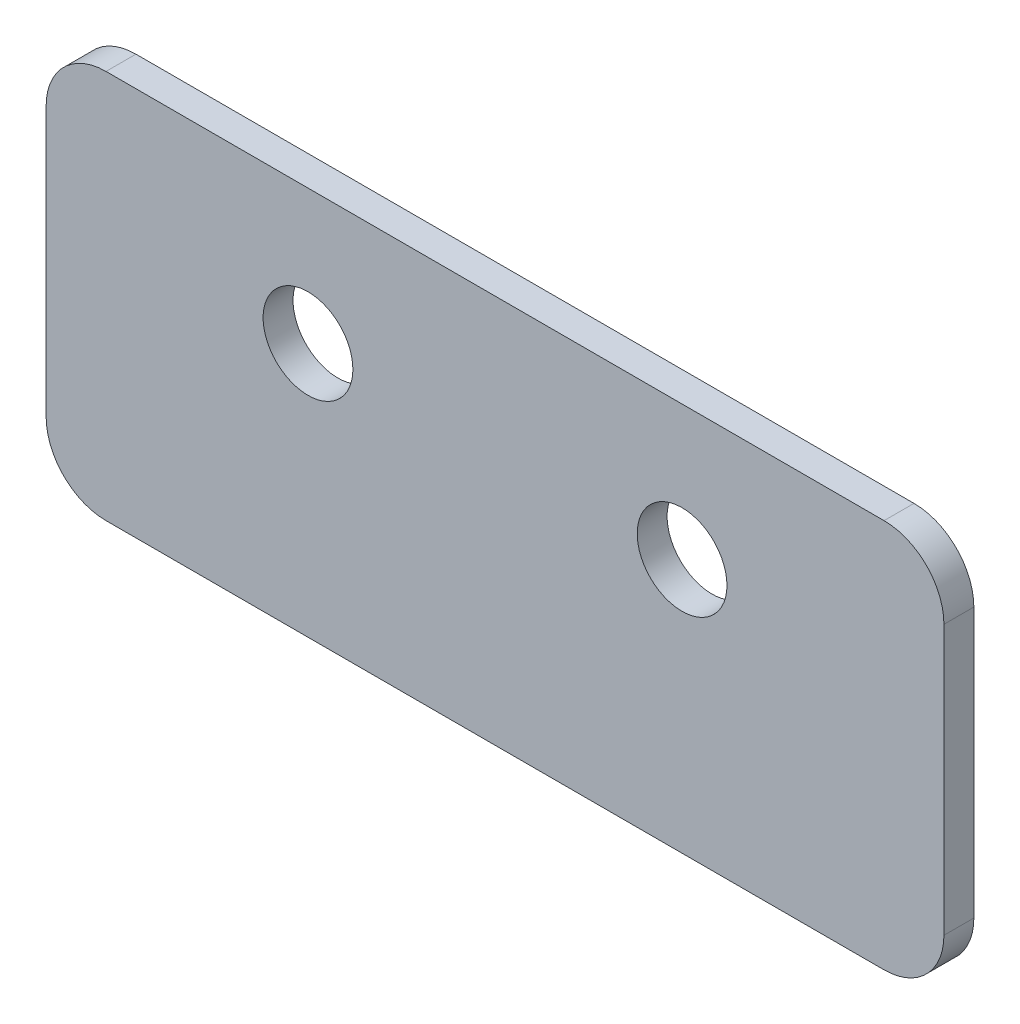
ISO-10303-21;
HEADER;
FILE_DESCRIPTION(('STEP AP214'),'2;1');
FILE_NAME('part.step','',(''),(''),'','','');
FILE_SCHEMA(('AUTOMOTIVE_DESIGN { 1 0 10303 214 1 1 1 1 }'));
ENDSEC;
DATA;
#1=APPLICATION_CONTEXT('core data for automotive mechanical design processes');
#2=APPLICATION_PROTOCOL_DEFINITION('international standard','automotive_design',2000,#1);
#3=PRODUCT_CONTEXT('',#1,'mechanical');
#4=PRODUCT('Part','Part','',(#3));
#5=PRODUCT_RELATED_PRODUCT_CATEGORY('part','',(#4));
#6=PRODUCT_DEFINITION_FORMATION('','',#4);
#7=PRODUCT_DEFINITION_CONTEXT('part definition',#1,'design');
#8=PRODUCT_DEFINITION('design','',#6,#7);
#9=PRODUCT_DEFINITION_SHAPE('','',#8);
#10=(LENGTH_UNIT() NAMED_UNIT(*) SI_UNIT(.MILLI.,.METRE.));
#11=(NAMED_UNIT(*) PLANE_ANGLE_UNIT() SI_UNIT($,.RADIAN.));
#12=(NAMED_UNIT(*) SI_UNIT($,.STERADIAN.) SOLID_ANGLE_UNIT());
#13=UNCERTAINTY_MEASURE_WITH_UNIT(LENGTH_MEASURE(1.E-05),#10,'distance_accuracy_value','');
#14=(GEOMETRIC_REPRESENTATION_CONTEXT(3) GLOBAL_UNCERTAINTY_ASSIGNED_CONTEXT((#13)) GLOBAL_UNIT_ASSIGNED_CONTEXT((#10,
#11,#12)) REPRESENTATION_CONTEXT('',''));
#15=CARTESIAN_POINT('',(0.,0.,0.));
#16=DIRECTION('',(0.,0.,1.));
#17=DIRECTION('',(1.,0.,0.));
#18=AXIS2_PLACEMENT_3D('',#15,#16,#17);
#19=CARTESIAN_POINT('',(13.,-6.5,1.));
#20=DIRECTION('',(0.,0.,1.));
#21=DIRECTION('',(1.,0.,0.));
#22=AXIS2_PLACEMENT_3D('',#19,#20,#21);
#23=PLANE('',#22);
#24=CARTESIAN_POINT('',(-6.25,0.,1.));
#25=DIRECTION('',(0.,0.,1.));
#26=DIRECTION('',(1.,0.,0.));
#27=AXIS2_PLACEMENT_3D('',#24,#25,#26);
#28=CIRCLE('',#27,1.5);
#29=CARTESIAN_POINT('',(-4.75,0.,1.));
#30=VERTEX_POINT('',#29);
#31=EDGE_CURVE('E134',#30,#30,#28,.T.);
#32=ORIENTED_EDGE('',*,*,#31,.F.);
#33=EDGE_LOOP('',(#32));
#34=FACE_BOUND('',#33,.T.);
#35=CARTESIAN_POINT('',(13.,-6.5,1.));
#36=DIRECTION('',(0.,0.,1.));
#37=DIRECTION('',(1.,0.,0.));
#38=AXIS2_PLACEMENT_3D('',#35,#36,#37);
#39=CIRCLE('',#38,2.);
#40=CARTESIAN_POINT('',(13.,-8.5,1.));
#41=VERTEX_POINT('',#40);
#42=CARTESIAN_POINT('',(15.,-6.5,1.));
#43=VERTEX_POINT('',#42);
#44=EDGE_CURVE('E145',#41,#43,#39,.T.);
#45=ORIENTED_EDGE('',*,*,#44,.T.);
#46=DIRECTION('',(0.,1.,0.));
#47=VECTOR('',#46,1.);
#48=CARTESIAN_POINT('',(15.,2.5,1.));
#49=LINE('',#48,#47);
#50=CARTESIAN_POINT('',(15.,2.5,1.));
#51=VERTEX_POINT('',#50);
#52=EDGE_CURVE('E93',#43,#51,#49,.T.);
#53=ORIENTED_EDGE('',*,*,#52,.T.);
#54=CARTESIAN_POINT('',(13.,2.5,1.));
#55=DIRECTION('',(0.,0.,1.));
#56=DIRECTION('',(-1.,0.,0.));
#57=AXIS2_PLACEMENT_3D('',#54,#55,#56);
#58=CIRCLE('',#57,2.);
#59=CARTESIAN_POINT('',(13.,4.50000000000001,1.));
#60=VERTEX_POINT('',#59);
#61=EDGE_CURVE('E160',#51,#60,#58,.T.);
#62=ORIENTED_EDGE('',*,*,#61,.T.);
#63=DIRECTION('',(-1.,0.,0.));
#64=VECTOR('',#63,1.);
#65=CARTESIAN_POINT('',(-13.,4.5,1.));
#66=LINE('',#65,#64);
#67=CARTESIAN_POINT('',(-13.,4.5,1.));
#68=VERTEX_POINT('',#67);
#69=EDGE_CURVE('E173',#60,#68,#66,.T.);
#70=ORIENTED_EDGE('',*,*,#69,.T.);
#71=CARTESIAN_POINT('',(-13.,2.5,1.));
#72=DIRECTION('',(0.,0.,1.));
#73=DIRECTION('',(1.,0.,0.));
#74=AXIS2_PLACEMENT_3D('',#71,#72,#73);
#75=CIRCLE('',#74,2.);
#76=CARTESIAN_POINT('',(-15.,2.5,1.));
#77=VERTEX_POINT('',#76);
#78=EDGE_CURVE('E112',#68,#77,#75,.T.);
#79=ORIENTED_EDGE('',*,*,#78,.T.);
#80=DIRECTION('',(0.,-1.,0.));
#81=VECTOR('',#80,1.);
#82=CARTESIAN_POINT('',(-15.,2.5,1.));
#83=LINE('',#82,#81);
#84=CARTESIAN_POINT('',(-15.,-6.5,1.));
#85=VERTEX_POINT('',#84);
#86=EDGE_CURVE('E106',#77,#85,#83,.T.);
#87=ORIENTED_EDGE('',*,*,#86,.T.);
#88=CARTESIAN_POINT('',(-13.,-6.5,1.));
#89=DIRECTION('',(0.,0.,1.));
#90=DIRECTION('',(1.,0.,0.));
#91=AXIS2_PLACEMENT_3D('',#88,#89,#90);
#92=CIRCLE('',#91,2.);
#93=CARTESIAN_POINT('',(-13.,-8.5,1.));
#94=VERTEX_POINT('',#93);
#95=EDGE_CURVE('E110',#85,#94,#92,.T.);
#96=ORIENTED_EDGE('',*,*,#95,.T.);
#97=DIRECTION('',(1.,0.,0.));
#98=VECTOR('',#97,1.);
#99=CARTESIAN_POINT('',(-13.,-8.5,1.));
#100=LINE('',#99,#98);
#101=EDGE_CURVE('E50',#94,#41,#100,.T.);
#102=ORIENTED_EDGE('',*,*,#101,.T.);
#103=EDGE_LOOP('',(#45,#53,#62,#70,#79,#87,#96,#102));
#104=FACE_BOUND('',#103,.T.);
#105=CARTESIAN_POINT('',(6.25,0.,1.));
#106=DIRECTION('',(0.,0.,1.));
#107=DIRECTION('',(1.,0.,0.));
#108=AXIS2_PLACEMENT_3D('',#105,#106,#107);
#109=CIRCLE('',#108,1.5);
#110=CARTESIAN_POINT('',(7.75,0.,1.));
#111=VERTEX_POINT('',#110);
#112=EDGE_CURVE('E182',#111,#111,#109,.T.);
#113=ORIENTED_EDGE('',*,*,#112,.F.);
#114=EDGE_LOOP('',(#113));
#115=FACE_BOUND('',#114,.T.);
#116=ADVANCED_FACE('F33',(#34,#104,#115),#23,.T.);
#117=CARTESIAN_POINT('',(13.,-6.5,0.));
#118=DIRECTION('',(0.,0.,1.));
#119=DIRECTION('',(1.,0.,0.));
#120=AXIS2_PLACEMENT_3D('',#117,#118,#119);
#121=PLANE('',#120);
#122=CARTESIAN_POINT('',(13.,-6.5,0.));
#123=DIRECTION('',(0.,0.,1.));
#124=DIRECTION('',(1.,0.,0.));
#125=AXIS2_PLACEMENT_3D('',#122,#123,#124);
#126=CIRCLE('',#125,2.);
#127=CARTESIAN_POINT('',(13.,-8.5,0.));
#128=VERTEX_POINT('',#127);
#129=CARTESIAN_POINT('',(15.,-6.5,0.));
#130=VERTEX_POINT('',#129);
#131=EDGE_CURVE('E130',#128,#130,#126,.T.);
#132=ORIENTED_EDGE('',*,*,#131,.F.);
#133=DIRECTION('',(1.,0.,0.));
#134=VECTOR('',#133,1.);
#135=CARTESIAN_POINT('',(-13.,-8.5,0.));
#136=LINE('',#135,#134);
#137=CARTESIAN_POINT('',(-13.,-8.5,0.));
#138=VERTEX_POINT('',#137);
#139=EDGE_CURVE('E85',#138,#128,#136,.T.);
#140=ORIENTED_EDGE('',*,*,#139,.F.);
#141=CARTESIAN_POINT('',(-13.,-6.5,0.));
#142=DIRECTION('',(0.,0.,1.));
#143=DIRECTION('',(1.,0.,0.));
#144=AXIS2_PLACEMENT_3D('',#141,#142,#143);
#145=CIRCLE('',#144,2.);
#146=CARTESIAN_POINT('',(-15.,-6.5,0.));
#147=VERTEX_POINT('',#146);
#148=EDGE_CURVE('E79',#147,#138,#145,.T.);
#149=ORIENTED_EDGE('',*,*,#148,.F.);
#150=DIRECTION('',(0.,-1.,0.));
#151=VECTOR('',#150,1.);
#152=CARTESIAN_POINT('',(-15.,2.5,0.));
#153=LINE('',#152,#151);
#154=CARTESIAN_POINT('',(-15.,2.5,0.));
#155=VERTEX_POINT('',#154);
#156=EDGE_CURVE('E120',#155,#147,#153,.T.);
#157=ORIENTED_EDGE('',*,*,#156,.F.);
#158=CARTESIAN_POINT('',(-13.,2.5,0.));
#159=DIRECTION('',(0.,0.,1.));
#160=DIRECTION('',(1.,0.,0.));
#161=AXIS2_PLACEMENT_3D('',#158,#159,#160);
#162=CIRCLE('',#161,2.);
#163=CARTESIAN_POINT('',(-13.,4.5,0.));
#164=VERTEX_POINT('',#163);
#165=EDGE_CURVE('E140',#164,#155,#162,.T.);
#166=ORIENTED_EDGE('',*,*,#165,.F.);
#167=DIRECTION('',(-1.,0.,0.));
#168=VECTOR('',#167,1.);
#169=CARTESIAN_POINT('',(-13.,4.5,0.));
#170=LINE('',#169,#168);
#171=CARTESIAN_POINT('',(13.,4.50000000000001,0.));
#172=VERTEX_POINT('',#171);
#173=EDGE_CURVE('E138',#172,#164,#170,.T.);
#174=ORIENTED_EDGE('',*,*,#173,.F.);
#175=CARTESIAN_POINT('',(13.,2.5,0.));
#176=DIRECTION('',(0.,0.,1.));
#177=DIRECTION('',(-1.,0.,0.));
#178=AXIS2_PLACEMENT_3D('',#175,#176,#177);
#179=CIRCLE('',#178,2.);
#180=CARTESIAN_POINT('',(15.,2.5,0.));
#181=VERTEX_POINT('',#180);
#182=EDGE_CURVE('E136',#181,#172,#179,.T.);
#183=ORIENTED_EDGE('',*,*,#182,.F.);
#184=DIRECTION('',(0.,1.,0.));
#185=VECTOR('',#184,1.);
#186=CARTESIAN_POINT('',(15.,2.5,0.));
#187=LINE('',#186,#185);
#188=EDGE_CURVE('E133',#130,#181,#187,.T.);
#189=ORIENTED_EDGE('',*,*,#188,.F.);
#190=EDGE_LOOP('',(#132,#140,#149,#157,#166,#174,#183,#189));
#191=FACE_BOUND('',#190,.T.);
#192=CARTESIAN_POINT('',(-6.25,0.,0.));
#193=DIRECTION('',(0.,0.,1.));
#194=DIRECTION('',(1.,0.,0.));
#195=AXIS2_PLACEMENT_3D('',#192,#193,#194);
#196=CIRCLE('',#195,1.5);
#197=CARTESIAN_POINT('',(-4.75,0.,0.));
#198=VERTEX_POINT('',#197);
#199=EDGE_CURVE('E179',#198,#198,#196,.T.);
#200=ORIENTED_EDGE('',*,*,#199,.T.);
#201=EDGE_LOOP('',(#200));
#202=FACE_BOUND('',#201,.T.);
#203=CARTESIAN_POINT('',(6.25,0.,0.));
#204=DIRECTION('',(0.,0.,1.));
#205=DIRECTION('',(1.,0.,0.));
#206=AXIS2_PLACEMENT_3D('',#203,#204,#205);
#207=CIRCLE('',#206,1.5);
#208=CARTESIAN_POINT('',(7.75,0.,0.));
#209=VERTEX_POINT('',#208);
#210=EDGE_CURVE('E185',#209,#209,#207,.T.);
#211=ORIENTED_EDGE('',*,*,#210,.T.);
#212=EDGE_LOOP('',(#211));
#213=FACE_BOUND('',#212,.T.);
#214=ADVANCED_FACE('F164',(#191,#202,#213),#121,.F.);
#215=CARTESIAN_POINT('',(13.,-6.5,1.));
#216=DIRECTION('',(0.,0.,-1.));
#217=DIRECTION('',(-1.,0.,0.));
#218=AXIS2_PLACEMENT_3D('',#215,#216,#217);
#219=CYLINDRICAL_SURFACE('',#218,2.);
#220=ORIENTED_EDGE('',*,*,#131,.T.);
#221=DIRECTION('',(0.,0.,-1.));
#222=VECTOR('',#221,1.);
#223=CARTESIAN_POINT('',(15.,-6.5,1.));
#224=LINE('',#223,#222);
#225=EDGE_CURVE('E11',#43,#130,#224,.T.);
#226=ORIENTED_EDGE('',*,*,#225,.F.);
#227=ORIENTED_EDGE('',*,*,#44,.F.);
#228=DIRECTION('',(0.,0.,-1.));
#229=VECTOR('',#228,1.);
#230=CARTESIAN_POINT('',(13.,-8.5,1.));
#231=LINE('',#230,#229);
#232=EDGE_CURVE('E126',#41,#128,#231,.T.);
#233=ORIENTED_EDGE('',*,*,#232,.T.);
#234=EDGE_LOOP('',(#220,#226,#227,#233));
#235=FACE_BOUND('',#234,.T.);
#236=ADVANCED_FACE('F35',(#235),#219,.T.);
#237=CARTESIAN_POINT('',(15.,2.5,1.));
#238=DIRECTION('',(-1.,0.,0.));
#239=DIRECTION('',(0.,-1.,0.));
#240=AXIS2_PLACEMENT_3D('',#237,#238,#239);
#241=PLANE('',#240);
#242=ORIENTED_EDGE('',*,*,#188,.T.);
#243=DIRECTION('',(0.,0.,-1.));
#244=VECTOR('',#243,1.);
#245=CARTESIAN_POINT('',(15.,2.5,1.));
#246=LINE('',#245,#244);
#247=EDGE_CURVE('E42',#51,#181,#246,.T.);
#248=ORIENTED_EDGE('',*,*,#247,.F.);
#249=ORIENTED_EDGE('',*,*,#52,.F.);
#250=ORIENTED_EDGE('',*,*,#225,.T.);
#251=EDGE_LOOP('',(#242,#248,#249,#250));
#252=FACE_BOUND('',#251,.T.);
#253=ADVANCED_FACE('F217',(#252),#241,.F.);
#254=CARTESIAN_POINT('',(13.,2.5,1.));
#255=DIRECTION('',(0.,0.,-1.));
#256=DIRECTION('',(-1.,0.,0.));
#257=AXIS2_PLACEMENT_3D('',#254,#255,#256);
#258=CYLINDRICAL_SURFACE('',#257,2.);
#259=ORIENTED_EDGE('',*,*,#182,.T.);
#260=DIRECTION('',(0.,0.,-1.));
#261=VECTOR('',#260,1.);
#262=CARTESIAN_POINT('',(13.,4.50000000000001,1.));
#263=LINE('',#262,#261);
#264=EDGE_CURVE('E152',#60,#172,#263,.T.);
#265=ORIENTED_EDGE('',*,*,#264,.F.);
#266=ORIENTED_EDGE('',*,*,#61,.F.);
#267=ORIENTED_EDGE('',*,*,#247,.T.);
#268=EDGE_LOOP('',(#259,#265,#266,#267));
#269=FACE_BOUND('',#268,.T.);
#270=ADVANCED_FACE('F158',(#269),#258,.T.);
#271=CARTESIAN_POINT('',(-13.,4.5,1.));
#272=DIRECTION('',(0.,-1.,0.));
#273=DIRECTION('',(1.,0.,0.));
#274=AXIS2_PLACEMENT_3D('',#271,#272,#273);
#275=PLANE('',#274);
#276=ORIENTED_EDGE('',*,*,#173,.T.);
#277=DIRECTION('',(0.,0.,-1.));
#278=VECTOR('',#277,1.);
#279=CARTESIAN_POINT('',(-13.,4.5,1.));
#280=LINE('',#279,#278);
#281=EDGE_CURVE('E149',#68,#164,#280,.T.);
#282=ORIENTED_EDGE('',*,*,#281,.F.);
#283=ORIENTED_EDGE('',*,*,#69,.F.);
#284=ORIENTED_EDGE('',*,*,#264,.T.);
#285=EDGE_LOOP('',(#276,#282,#283,#284));
#286=FACE_BOUND('',#285,.T.);
#287=ADVANCED_FACE('F169',(#286),#275,.F.);
#288=CARTESIAN_POINT('',(-13.,2.5,1.));
#289=DIRECTION('',(0.,0.,-1.));
#290=DIRECTION('',(-1.,0.,0.));
#291=AXIS2_PLACEMENT_3D('',#288,#289,#290);
#292=CYLINDRICAL_SURFACE('',#291,2.);
#293=ORIENTED_EDGE('',*,*,#165,.T.);
#294=DIRECTION('',(0.,0.,-1.));
#295=VECTOR('',#294,1.);
#296=CARTESIAN_POINT('',(-15.,2.5,1.));
#297=LINE('',#296,#295);
#298=EDGE_CURVE('E121',#77,#155,#297,.T.);
#299=ORIENTED_EDGE('',*,*,#298,.F.);
#300=ORIENTED_EDGE('',*,*,#78,.F.);
#301=ORIENTED_EDGE('',*,*,#281,.T.);
#302=EDGE_LOOP('',(#293,#299,#300,#301));
#303=FACE_BOUND('',#302,.T.);
#304=ADVANCED_FACE('F172',(#303),#292,.T.);
#305=CARTESIAN_POINT('',(-15.,2.5,1.));
#306=DIRECTION('',(1.,0.,0.));
#307=DIRECTION('',(0.,1.,0.));
#308=AXIS2_PLACEMENT_3D('',#305,#306,#307);
#309=PLANE('',#308);
#310=ORIENTED_EDGE('',*,*,#156,.T.);
#311=DIRECTION('',(0.,0.,-1.));
#312=VECTOR('',#311,1.);
#313=CARTESIAN_POINT('',(-15.,-6.5,1.));
#314=LINE('',#313,#312);
#315=EDGE_CURVE('E117',#85,#147,#314,.T.);
#316=ORIENTED_EDGE('',*,*,#315,.F.);
#317=ORIENTED_EDGE('',*,*,#86,.F.);
#318=ORIENTED_EDGE('',*,*,#298,.T.);
#319=EDGE_LOOP('',(#310,#316,#317,#318));
#320=FACE_BOUND('',#319,.T.);
#321=ADVANCED_FACE('F118',(#320),#309,.F.);
#322=CARTESIAN_POINT('',(-13.,-6.5,1.));
#323=DIRECTION('',(0.,0.,-1.));
#324=DIRECTION('',(-1.,0.,0.));
#325=AXIS2_PLACEMENT_3D('',#322,#323,#324);
#326=CYLINDRICAL_SURFACE('',#325,2.);
#327=ORIENTED_EDGE('',*,*,#148,.T.);
#328=DIRECTION('',(0.,0.,-1.));
#329=VECTOR('',#328,1.);
#330=CARTESIAN_POINT('',(-13.,-8.5,1.));
#331=LINE('',#330,#329);
#332=EDGE_CURVE('E122',#94,#138,#331,.T.);
#333=ORIENTED_EDGE('',*,*,#332,.F.);
#334=ORIENTED_EDGE('',*,*,#95,.F.);
#335=ORIENTED_EDGE('',*,*,#315,.T.);
#336=EDGE_LOOP('',(#327,#333,#334,#335));
#337=FACE_BOUND('',#336,.T.);
#338=ADVANCED_FACE('F124',(#337),#326,.T.);
#339=CARTESIAN_POINT('',(-13.,-8.5,1.));
#340=DIRECTION('',(0.,1.,0.));
#341=DIRECTION('',(-1.,0.,0.));
#342=AXIS2_PLACEMENT_3D('',#339,#340,#341);
#343=PLANE('',#342);
#344=ORIENTED_EDGE('',*,*,#139,.T.);
#345=ORIENTED_EDGE('',*,*,#232,.F.);
#346=ORIENTED_EDGE('',*,*,#101,.F.);
#347=ORIENTED_EDGE('',*,*,#332,.T.);
#348=EDGE_LOOP('',(#344,#345,#346,#347));
#349=FACE_BOUND('',#348,.T.);
#350=ADVANCED_FACE('F205',(#349),#343,.F.);
#351=CARTESIAN_POINT('',(-6.25,0.,1.));
#352=DIRECTION('',(0.,0.,-1.));
#353=DIRECTION('',(-1.,0.,0.));
#354=AXIS2_PLACEMENT_3D('',#351,#352,#353);
#355=CYLINDRICAL_SURFACE('',#354,1.5);
#356=ORIENTED_EDGE('',*,*,#31,.T.);
#357=EDGE_LOOP('',(#356));
#358=FACE_BOUND('',#357,.T.);
#359=ORIENTED_EDGE('',*,*,#199,.F.);
#360=EDGE_LOOP('',(#359));
#361=FACE_BOUND('',#360,.T.);
#362=ADVANCED_FACE('F202',(#358,#361),#355,.F.);
#363=CARTESIAN_POINT('',(6.25,0.,1.));
#364=DIRECTION('',(0.,0.,-1.));
#365=DIRECTION('',(-1.,0.,0.));
#366=AXIS2_PLACEMENT_3D('',#363,#364,#365);
#367=CYLINDRICAL_SURFACE('',#366,1.5);
#368=ORIENTED_EDGE('',*,*,#112,.T.);
#369=EDGE_LOOP('',(#368));
#370=FACE_BOUND('',#369,.T.);
#371=ORIENTED_EDGE('',*,*,#210,.F.);
#372=EDGE_LOOP('',(#371));
#373=FACE_BOUND('',#372,.T.);
#374=ADVANCED_FACE('F191',(#370,#373),#367,.F.);
#375=CLOSED_SHELL('',(#116,#214,#236,#253,#270,#287,#304,#321,#338,#350,#362,#374));
#376=MANIFOLD_SOLID_BREP('B2',#375);
#377=ADVANCED_BREP_SHAPE_REPRESENTATION('',(#18,#376),#14);
#378=SHAPE_DEFINITION_REPRESENTATION(#9,#377);
ENDSEC;
END-ISO-10303-21;
